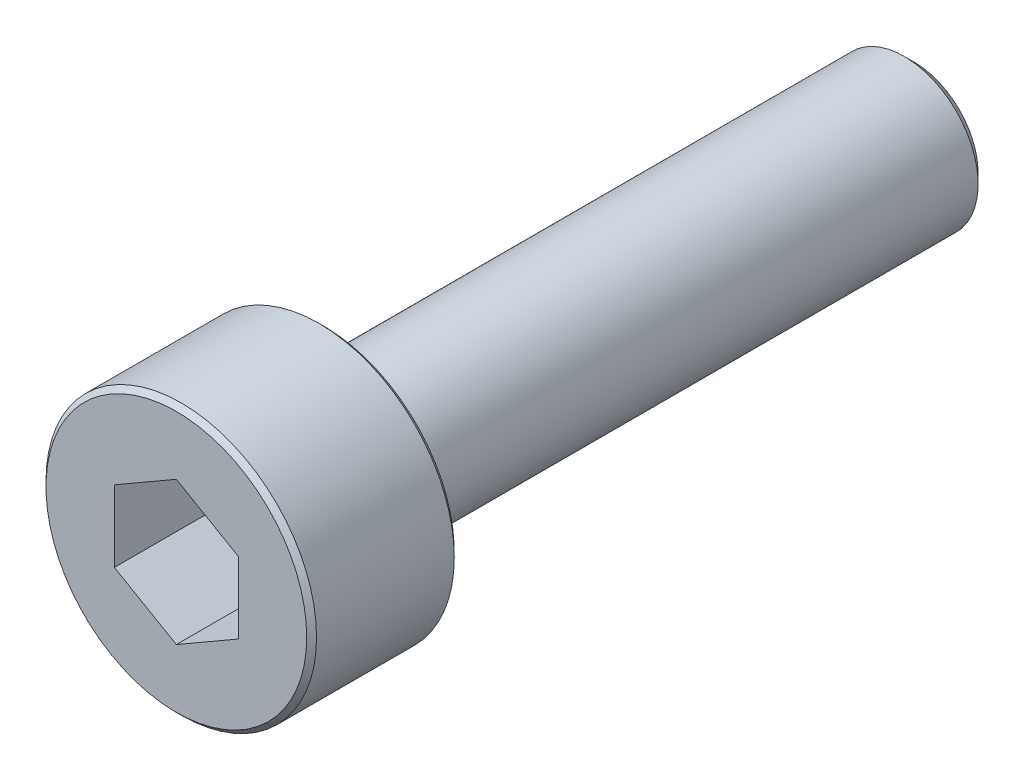
ISO-10303-21;
HEADER;
FILE_DESCRIPTION(('STEP AP214'),'2;1');
FILE_NAME('part.step','',(''),(''),'','','');
FILE_SCHEMA(('AUTOMOTIVE_DESIGN { 1 0 10303 214 1 1 1 1 }'));
ENDSEC;
DATA;
#1=APPLICATION_CONTEXT('core data for automotive mechanical design processes');
#2=APPLICATION_PROTOCOL_DEFINITION('international standard','automotive_design',2000,#1);
#3=PRODUCT_CONTEXT('',#1,'mechanical');
#4=PRODUCT('Part','Part','',(#3));
#5=PRODUCT_RELATED_PRODUCT_CATEGORY('part','',(#4));
#6=PRODUCT_DEFINITION_FORMATION('','',#4);
#7=PRODUCT_DEFINITION_CONTEXT('part definition',#1,'design');
#8=PRODUCT_DEFINITION('design','',#6,#7);
#9=PRODUCT_DEFINITION_SHAPE('','',#8);
#10=(LENGTH_UNIT() NAMED_UNIT(*) SI_UNIT(.MILLI.,.METRE.));
#11=(NAMED_UNIT(*) PLANE_ANGLE_UNIT() SI_UNIT($,.RADIAN.));
#12=(NAMED_UNIT(*) SI_UNIT($,.STERADIAN.) SOLID_ANGLE_UNIT());
#13=UNCERTAINTY_MEASURE_WITH_UNIT(LENGTH_MEASURE(1.E-05),#10,'distance_accuracy_value','');
#14=(GEOMETRIC_REPRESENTATION_CONTEXT(3) GLOBAL_UNCERTAINTY_ASSIGNED_CONTEXT((#13)) GLOBAL_UNIT_ASSIGNED_CONTEXT((#10,
#11,#12)) REPRESENTATION_CONTEXT('',''));
#15=CARTESIAN_POINT('',(0.,0.,0.));
#16=DIRECTION('',(0.,0.,1.));
#17=DIRECTION('',(1.,0.,0.));
#18=AXIS2_PLACEMENT_3D('',#15,#16,#17);
#19=CARTESIAN_POINT('',(0.,0.,12.));
#20=DIRECTION('',(0.,0.,1.));
#21=DIRECTION('',(1.,0.,0.));
#22=AXIS2_PLACEMENT_3D('',#19,#20,#21);
#23=CYLINDRICAL_SURFACE('',#22,2.75);
#24=CARTESIAN_POINT('',(0.,0.,12.100001016379));
#25=DIRECTION('',(0.,0.,-1.));
#26=DIRECTION('',(-1.,0.,0.));
#27=AXIS2_PLACEMENT_3D('',#24,#25,#26);
#28=CIRCLE('',#27,2.75);
#29=CARTESIAN_POINT('',(-2.75,0.,12.100001016379));
#30=VERTEX_POINT('',#29);
#31=EDGE_CURVE('E153',#30,#30,#28,.F.);
#32=ORIENTED_EDGE('',*,*,#31,.T.);
#33=EDGE_LOOP('',(#32));
#34=FACE_BOUND('',#33,.T.);
#35=CARTESIAN_POINT('',(0.,0.,14.899998908474));
#36=DIRECTION('',(0.,0.,1.));
#37=DIRECTION('',(1.,0.,0.));
#38=AXIS2_PLACEMENT_3D('',#35,#36,#37);
#39=CIRCLE('',#38,2.75);
#40=CARTESIAN_POINT('',(2.75,0.,14.899998908474));
#41=VERTEX_POINT('',#40);
#42=EDGE_CURVE('E150',#41,#41,#39,.F.);
#43=ORIENTED_EDGE('',*,*,#42,.T.);
#44=EDGE_LOOP('',(#43));
#45=FACE_BOUND('',#44,.T.);
#46=ADVANCED_FACE('F39',(#34,#45),#23,.T.);
#47=CARTESIAN_POINT('',(2.75,0.,12.));
#48=DIRECTION('',(0.,0.,-1.));
#49=DIRECTION('',(-1.,0.,0.));
#50=AXIS2_PLACEMENT_3D('',#47,#48,#49);
#51=PLANE('',#50);
#52=CARTESIAN_POINT('',(0.,0.,12.));
#53=DIRECTION('',(0.,0.,-1.));
#54=DIRECTION('',(-1.,0.,0.));
#55=AXIS2_PLACEMENT_3D('',#52,#53,#54);
#56=CIRCLE('',#55,2.64999890847404);
#57=CARTESIAN_POINT('',(-2.64999890847404,0.,12.));
#58=VERTEX_POINT('',#57);
#59=EDGE_CURVE('E156',#58,#58,#56,.T.);
#60=ORIENTED_EDGE('',*,*,#59,.T.);
#61=EDGE_LOOP('',(#60));
#62=FACE_BOUND('',#61,.T.);
#63=CARTESIAN_POINT('',(0.,0.,12.));
#64=DIRECTION('',(0.,0.,-1.));
#65=DIRECTION('',(-1.,0.,0.));
#66=AXIS2_PLACEMENT_3D('',#63,#64,#65);
#67=CIRCLE('',#66,1.5);
#68=CARTESIAN_POINT('',(-1.5,0.,12.));
#69=VERTEX_POINT('',#68);
#70=EDGE_CURVE('E142',#69,#69,#67,.T.);
#71=ORIENTED_EDGE('',*,*,#70,.F.);
#72=EDGE_LOOP('',(#71));
#73=FACE_BOUND('',#72,.T.);
#74=ADVANCED_FACE('F176',(#62,#73),#51,.T.);
#75=CARTESIAN_POINT('',(0.,0.,15.));
#76=DIRECTION('',(0.,0.,1.));
#77=DIRECTION('',(1.,0.,0.));
#78=AXIS2_PLACEMENT_3D('',#75,#76,#77);
#79=PLANE('',#78);
#80=CARTESIAN_POINT('',(0.,0.,15.));
#81=DIRECTION('',(0.,0.,1.));
#82=DIRECTION('',(1.,0.,0.));
#83=AXIS2_PLACEMENT_3D('',#80,#81,#82);
#84=CIRCLE('',#83,2.64999898362104);
#85=CARTESIAN_POINT('',(2.64999898362104,0.,15.));
#86=VERTEX_POINT('',#85);
#87=EDGE_CURVE('E159',#86,#86,#84,.T.);
#88=ORIENTED_EDGE('',*,*,#87,.T.);
#89=EDGE_LOOP('',(#88));
#90=FACE_BOUND('',#89,.T.);
#91=DIRECTION('',(0.,-1.,0.));
#92=VECTOR('',#91,1.);
#93=CARTESIAN_POINT('',(-1.26000000000002,0.727461339178926,15.));
#94=LINE('',#93,#92);
#95=CARTESIAN_POINT('',(-1.26000000000002,0.727461339178926,15.));
#96=VERTEX_POINT('',#95);
#97=CARTESIAN_POINT('',(-1.26,-0.7274613391789,15.));
#98=VERTEX_POINT('',#97);
#99=EDGE_CURVE('E55',#96,#98,#94,.T.);
#100=ORIENTED_EDGE('',*,*,#99,.F.);
#101=DIRECTION('',(-0.866025403784441,-0.499999999999996,0.));
#102=VECTOR('',#101,1.);
#103=CARTESIAN_POINT('',(0.,1.45492267835786,15.));
#104=LINE('',#103,#102);
#105=CARTESIAN_POINT('',(0.,1.45492267835786,15.));
#106=VERTEX_POINT('',#105);
#107=EDGE_CURVE('E138',#106,#96,#104,.T.);
#108=ORIENTED_EDGE('',*,*,#107,.F.);
#109=DIRECTION('',(-0.86602540378445,0.49999999999998,0.));
#110=VECTOR('',#109,1.);
#111=CARTESIAN_POINT('',(1.26000000000013,0.727461339178913,15.));
#112=LINE('',#111,#110);
#113=CARTESIAN_POINT('',(1.26000000000013,0.727461339178913,15.));
#114=VERTEX_POINT('',#113);
#115=EDGE_CURVE('E136',#114,#106,#112,.T.);
#116=ORIENTED_EDGE('',*,*,#115,.F.);
#117=DIRECTION('',(0.,1.,0.));
#118=VECTOR('',#117,1.);
#119=CARTESIAN_POINT('',(1.26000000000013,-0.727461339178913,15.));
#120=LINE('',#119,#118);
#121=CARTESIAN_POINT('',(1.26000000000013,-0.727461339178913,15.));
#122=VERTEX_POINT('',#121);
#123=EDGE_CURVE('E103',#122,#114,#120,.T.);
#124=ORIENTED_EDGE('',*,*,#123,.F.);
#125=DIRECTION('',(0.866025403784438,0.5,0.));
#126=VECTOR('',#125,1.);
#127=CARTESIAN_POINT('',(0.,-1.45492267835787,15.));
#128=LINE('',#127,#126);
#129=CARTESIAN_POINT('',(0.,-1.45492267835787,15.));
#130=VERTEX_POINT('',#129);
#131=EDGE_CURVE('E132',#130,#122,#128,.T.);
#132=ORIENTED_EDGE('',*,*,#131,.F.);
#133=DIRECTION('',(0.866025403784439,-0.5,0.));
#134=VECTOR('',#133,1.);
#135=CARTESIAN_POINT('',(-1.26,-0.7274613391789,15.));
#136=LINE('',#135,#134);
#137=EDGE_CURVE('E129',#98,#130,#136,.T.);
#138=ORIENTED_EDGE('',*,*,#137,.F.);
#139=EDGE_LOOP('',(#100,#108,#116,#124,#132,#138));
#140=FACE_BOUND('',#139,.T.);
#141=ADVANCED_FACE('F182',(#90,#140),#79,.T.);
#142=CARTESIAN_POINT('',(0.,0.,0.));
#143=DIRECTION('',(0.,0.,1.));
#144=DIRECTION('',(1.,0.,0.));
#145=AXIS2_PLACEMENT_3D('',#142,#143,#144);
#146=CYLINDRICAL_SURFACE('',#145,1.5);
#147=CARTESIAN_POINT('',(0.,0.,0.200009601945088));
#148=DIRECTION('',(0.,0.,-1.));
#149=DIRECTION('',(-1.,0.,0.));
#150=AXIS2_PLACEMENT_3D('',#147,#148,#149);
#151=CIRCLE('',#150,1.5);
#152=CARTESIAN_POINT('',(-1.5,0.,0.200009601945088));
#153=VERTEX_POINT('',#152);
#154=EDGE_CURVE('E11',#153,#153,#151,.F.);
#155=ORIENTED_EDGE('',*,*,#154,.T.);
#156=EDGE_LOOP('',(#155));
#157=FACE_BOUND('',#156,.T.);
#158=ORIENTED_EDGE('',*,*,#70,.T.);
#159=EDGE_LOOP('',(#158));
#160=FACE_BOUND('',#159,.T.);
#161=ADVANCED_FACE('F209',(#157,#160),#146,.T.);
#162=CARTESIAN_POINT('',(0.,0.,0.));
#163=DIRECTION('',(0.,0.,-1.));
#164=DIRECTION('',(-1.,0.,0.));
#165=AXIS2_PLACEMENT_3D('',#162,#163,#164);
#166=PLANE('',#165);
#167=CARTESIAN_POINT('',(0.,0.,0.));
#168=DIRECTION('',(0.,0.,-1.));
#169=DIRECTION('',(-1.,0.,0.));
#170=AXIS2_PLACEMENT_3D('',#167,#168,#169);
#171=CIRCLE('',#170,1.29999167838848);
#172=CARTESIAN_POINT('',(-1.29999167838848,0.,0.));
#173=VERTEX_POINT('',#172);
#174=EDGE_CURVE('E48',#173,#173,#171,.T.);
#175=ORIENTED_EDGE('',*,*,#174,.T.);
#176=EDGE_LOOP('',(#175));
#177=FACE_BOUND('',#176,.T.);
#178=ADVANCED_FACE('F164',(#177),#166,.T.);
#179=CARTESIAN_POINT('',(-1.26000000000002,0.727461339178926,12.75));
#180=DIRECTION('',(-1.,0.,0.));
#181=DIRECTION('',(0.,-1.,0.));
#182=AXIS2_PLACEMENT_3D('',#179,#180,#181);
#183=PLANE('',#182);
#184=ORIENTED_EDGE('',*,*,#99,.T.);
#185=DIRECTION('',(0.,0.,1.));
#186=VECTOR('',#185,1.);
#187=CARTESIAN_POINT('',(-1.26,-0.7274613391789,12.75));
#188=LINE('',#187,#186);
#189=CARTESIAN_POINT('',(-1.26,-0.7274613391789,12.75));
#190=VERTEX_POINT('',#189);
#191=EDGE_CURVE('E85',#190,#98,#188,.T.);
#192=ORIENTED_EDGE('',*,*,#191,.F.);
#193=DIRECTION('',(0.,-1.,0.));
#194=VECTOR('',#193,1.);
#195=CARTESIAN_POINT('',(-1.26000000000002,0.727461339178926,12.75));
#196=LINE('',#195,#194);
#197=CARTESIAN_POINT('',(-1.26000000000002,0.727461339178926,12.75));
#198=VERTEX_POINT('',#197);
#199=EDGE_CURVE('E140',#198,#190,#196,.T.);
#200=ORIENTED_EDGE('',*,*,#199,.F.);
#201=DIRECTION('',(0.,0.,1.));
#202=VECTOR('',#201,1.);
#203=CARTESIAN_POINT('',(-1.26000000000002,0.727461339178926,12.75));
#204=LINE('',#203,#202);
#205=EDGE_CURVE('E63',#198,#96,#204,.T.);
#206=ORIENTED_EDGE('',*,*,#205,.T.);
#207=EDGE_LOOP('',(#184,#192,#200,#206));
#208=FACE_BOUND('',#207,.T.);
#209=ADVANCED_FACE('F217',(#208),#183,.F.);
#210=CARTESIAN_POINT('',(0.,1.45492267835786,12.75));
#211=DIRECTION('',(-0.499999999999996,0.866025403784441,0.));
#212=DIRECTION('',(-0.866025403784441,-0.499999999999996,0.));
#213=AXIS2_PLACEMENT_3D('',#210,#211,#212);
#214=PLANE('',#213);
#215=ORIENTED_EDGE('',*,*,#107,.T.);
#216=ORIENTED_EDGE('',*,*,#205,.F.);
#217=DIRECTION('',(-0.866025403784441,-0.499999999999996,0.));
#218=VECTOR('',#217,1.);
#219=CARTESIAN_POINT('',(0.,1.45492267835786,12.75));
#220=LINE('',#219,#218);
#221=CARTESIAN_POINT('',(0.,1.45492267835786,12.75));
#222=VERTEX_POINT('',#221);
#223=EDGE_CURVE('E115',#222,#198,#220,.T.);
#224=ORIENTED_EDGE('',*,*,#223,.F.);
#225=DIRECTION('',(0.,0.,1.));
#226=VECTOR('',#225,1.);
#227=CARTESIAN_POINT('',(0.,1.45492267835786,12.75));
#228=LINE('',#227,#226);
#229=EDGE_CURVE('E107',#222,#106,#228,.T.);
#230=ORIENTED_EDGE('',*,*,#229,.T.);
#231=EDGE_LOOP('',(#215,#216,#224,#230));
#232=FACE_BOUND('',#231,.T.);
#233=ADVANCED_FACE('F223',(#232),#214,.F.);
#234=CARTESIAN_POINT('',(1.26000000000013,0.727461339178913,12.75));
#235=DIRECTION('',(0.49999999999998,0.86602540378445,0.));
#236=DIRECTION('',(-0.86602540378445,0.49999999999998,0.));
#237=AXIS2_PLACEMENT_3D('',#234,#235,#236);
#238=PLANE('',#237);
#239=ORIENTED_EDGE('',*,*,#115,.T.);
#240=ORIENTED_EDGE('',*,*,#229,.F.);
#241=DIRECTION('',(-0.86602540378445,0.49999999999998,0.));
#242=VECTOR('',#241,1.);
#243=CARTESIAN_POINT('',(1.26000000000013,0.727461339178913,12.75));
#244=LINE('',#243,#242);
#245=CARTESIAN_POINT('',(1.26000000000013,0.727461339178913,12.75));
#246=VERTEX_POINT('',#245);
#247=EDGE_CURVE('E111',#246,#222,#244,.T.);
#248=ORIENTED_EDGE('',*,*,#247,.F.);
#249=DIRECTION('',(0.,0.,1.));
#250=VECTOR('',#249,1.);
#251=CARTESIAN_POINT('',(1.26000000000013,0.727461339178913,12.75));
#252=LINE('',#251,#250);
#253=EDGE_CURVE('E96',#246,#114,#252,.T.);
#254=ORIENTED_EDGE('',*,*,#253,.T.);
#255=EDGE_LOOP('',(#239,#240,#248,#254));
#256=FACE_BOUND('',#255,.T.);
#257=ADVANCED_FACE('F112',(#256),#238,.F.);
#258=CARTESIAN_POINT('',(1.26000000000013,-0.727461339178913,12.75));
#259=DIRECTION('',(1.,0.,0.));
#260=DIRECTION('',(0.,0.,-1.));
#261=AXIS2_PLACEMENT_3D('',#258,#259,#260);
#262=PLANE('',#261);
#263=ORIENTED_EDGE('',*,*,#123,.T.);
#264=ORIENTED_EDGE('',*,*,#253,.F.);
#265=DIRECTION('',(0.,1.,0.));
#266=VECTOR('',#265,1.);
#267=CARTESIAN_POINT('',(1.26000000000013,-0.727461339178913,12.75));
#268=LINE('',#267,#266);
#269=CARTESIAN_POINT('',(1.26000000000013,-0.727461339178913,12.75));
#270=VERTEX_POINT('',#269);
#271=EDGE_CURVE('E100',#270,#246,#268,.T.);
#272=ORIENTED_EDGE('',*,*,#271,.F.);
#273=DIRECTION('',(0.,0.,1.));
#274=VECTOR('',#273,1.);
#275=CARTESIAN_POINT('',(1.26000000000013,-0.727461339178913,12.75));
#276=LINE('',#275,#274);
#277=EDGE_CURVE('E108',#270,#122,#276,.T.);
#278=ORIENTED_EDGE('',*,*,#277,.T.);
#279=EDGE_LOOP('',(#263,#264,#272,#278));
#280=FACE_BOUND('',#279,.T.);
#281=ADVANCED_FACE('F98',(#280),#262,.F.);
#282=CARTESIAN_POINT('',(0.,-1.45492267835787,12.75));
#283=DIRECTION('',(0.5,-0.866025403784439,0.));
#284=DIRECTION('',(0.866025403784439,0.5,0.));
#285=AXIS2_PLACEMENT_3D('',#282,#283,#284);
#286=PLANE('',#285);
#287=ORIENTED_EDGE('',*,*,#131,.T.);
#288=ORIENTED_EDGE('',*,*,#277,.F.);
#289=DIRECTION('',(0.866025403784438,0.5,0.));
#290=VECTOR('',#289,1.);
#291=CARTESIAN_POINT('',(0.,-1.45492267835787,12.75));
#292=LINE('',#291,#290);
#293=CARTESIAN_POINT('',(0.,-1.45492267835787,12.75));
#294=VERTEX_POINT('',#293);
#295=EDGE_CURVE('E121',#294,#270,#292,.T.);
#296=ORIENTED_EDGE('',*,*,#295,.F.);
#297=DIRECTION('',(0.,0.,1.));
#298=VECTOR('',#297,1.);
#299=CARTESIAN_POINT('',(0.,-1.45492267835787,12.75));
#300=LINE('',#299,#298);
#301=EDGE_CURVE('E145',#294,#130,#300,.T.);
#302=ORIENTED_EDGE('',*,*,#301,.T.);
#303=EDGE_LOOP('',(#287,#288,#296,#302));
#304=FACE_BOUND('',#303,.T.);
#305=ADVANCED_FACE('F226',(#304),#286,.F.);
#306=CARTESIAN_POINT('',(-1.26,-0.7274613391789,12.75));
#307=DIRECTION('',(-0.5,-0.866025403784439,0.));
#308=DIRECTION('',(0.866025403784439,-0.5,0.));
#309=AXIS2_PLACEMENT_3D('',#306,#307,#308);
#310=PLANE('',#309);
#311=ORIENTED_EDGE('',*,*,#137,.T.);
#312=ORIENTED_EDGE('',*,*,#301,.F.);
#313=DIRECTION('',(0.866025403784439,-0.5,0.));
#314=VECTOR('',#313,1.);
#315=CARTESIAN_POINT('',(-1.26,-0.7274613391789,12.75));
#316=LINE('',#315,#314);
#317=EDGE_CURVE('E123',#190,#294,#316,.T.);
#318=ORIENTED_EDGE('',*,*,#317,.F.);
#319=ORIENTED_EDGE('',*,*,#191,.T.);
#320=EDGE_LOOP('',(#311,#312,#318,#319));
#321=FACE_BOUND('',#320,.T.);
#322=ADVANCED_FACE('F201',(#321),#310,.F.);
#323=CARTESIAN_POINT('',(0.,0.,12.75));
#324=DIRECTION('',(0.,0.,1.));
#325=DIRECTION('',(1.,0.,0.));
#326=AXIS2_PLACEMENT_3D('',#323,#324,#325);
#327=PLANE('',#326);
#328=ORIENTED_EDGE('',*,*,#199,.T.);
#329=ORIENTED_EDGE('',*,*,#317,.T.);
#330=ORIENTED_EDGE('',*,*,#295,.T.);
#331=ORIENTED_EDGE('',*,*,#271,.T.);
#332=ORIENTED_EDGE('',*,*,#247,.T.);
#333=ORIENTED_EDGE('',*,*,#223,.T.);
#334=EDGE_LOOP('',(#328,#329,#330,#331,#332,#333));
#335=FACE_BOUND('',#334,.T.);
#336=ADVANCED_FACE('F118',(#335),#327,.T.);
#337=CARTESIAN_POINT('',(0.,0.,12.100001016379));
#338=DIRECTION('',(0.,0.,1.));
#339=DIRECTION('',(1.,0.,0.));
#340=AXIS2_PLACEMENT_3D('',#337,#338,#339);
#341=CONICAL_SURFACE('',#340,2.75,0.785398539128491);
#342=ORIENTED_EDGE('',*,*,#59,.F.);
#343=EDGE_LOOP('',(#342));
#344=FACE_BOUND('',#343,.T.);
#345=ORIENTED_EDGE('',*,*,#31,.F.);
#346=EDGE_LOOP('',(#345));
#347=FACE_BOUND('',#346,.T.);
#348=ADVANCED_FACE('F172',(#344,#347),#341,.T.);
#349=CARTESIAN_POINT('',(0.,0.,15.));
#350=DIRECTION('',(0.,0.,-1.));
#351=DIRECTION('',(-1.,0.,0.));
#352=AXIS2_PLACEMENT_3D('',#349,#350,#351);
#353=CONICAL_SURFACE('',#352,2.64999898362104,0.785397787666414);
#354=ORIENTED_EDGE('',*,*,#42,.F.);
#355=EDGE_LOOP('',(#354));
#356=FACE_BOUND('',#355,.T.);
#357=ORIENTED_EDGE('',*,*,#87,.F.);
#358=EDGE_LOOP('',(#357));
#359=FACE_BOUND('',#358,.T.);
#360=ADVANCED_FACE('F167',(#356,#359),#353,.T.);
#361=CARTESIAN_POINT('',(0.,0.,0.));
#362=DIRECTION('',(0.,0.,1.));
#363=DIRECTION('',(1.,0.,0.));
#364=AXIS2_PLACEMENT_3D('',#361,#362,#363);
#365=CONICAL_SURFACE('',#364,1.29999167838848,0.785394962706949);
#366=ORIENTED_EDGE('',*,*,#154,.F.);
#367=EDGE_LOOP('',(#366));
#368=FACE_BOUND('',#367,.T.);
#369=ORIENTED_EDGE('',*,*,#174,.F.);
#370=EDGE_LOOP('',(#369));
#371=FACE_BOUND('',#370,.T.);
#372=ADVANCED_FACE('F42',(#368,#371),#365,.T.);
#373=CLOSED_SHELL('',(#46,#74,#141,#161,#178,#209,#233,#257,#281,#305,#322,#336,#348,#360,#372));
#374=MANIFOLD_SOLID_BREP('B2',#373);
#375=ADVANCED_BREP_SHAPE_REPRESENTATION('',(#18,#374),#14);
#376=SHAPE_DEFINITION_REPRESENTATION(#9,#375);
ENDSEC;
END-ISO-10303-21;
